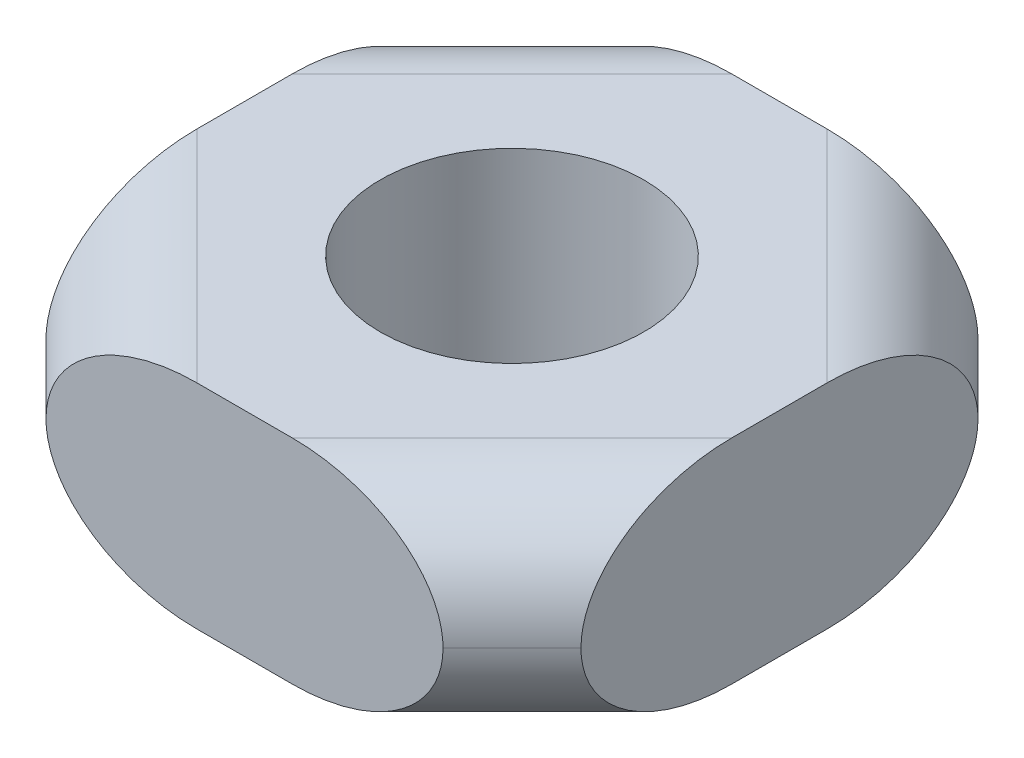
ISO-10303-21;
HEADER;
FILE_DESCRIPTION(('STEP AP214'),'2;1');
FILE_NAME('part.step','',(''),(''),'','','');
FILE_SCHEMA(('AUTOMOTIVE_DESIGN { 1 0 10303 214 1 1 1 1 }'));
ENDSEC;
DATA;
#1=APPLICATION_CONTEXT('core data for automotive mechanical design processes');
#2=APPLICATION_PROTOCOL_DEFINITION('international standard','automotive_design',2000,#1);
#3=PRODUCT_CONTEXT('',#1,'mechanical');
#4=PRODUCT('Part','Part','',(#3));
#5=PRODUCT_RELATED_PRODUCT_CATEGORY('part','',(#4));
#6=PRODUCT_DEFINITION_FORMATION('','',#4);
#7=PRODUCT_DEFINITION_CONTEXT('part definition',#1,'design');
#8=PRODUCT_DEFINITION('design','',#6,#7);
#9=PRODUCT_DEFINITION_SHAPE('','',#8);
#10=(LENGTH_UNIT() NAMED_UNIT(*) SI_UNIT(.MILLI.,.METRE.));
#11=(NAMED_UNIT(*) PLANE_ANGLE_UNIT() SI_UNIT($,.RADIAN.));
#12=(NAMED_UNIT(*) SI_UNIT($,.STERADIAN.) SOLID_ANGLE_UNIT());
#13=UNCERTAINTY_MEASURE_WITH_UNIT(LENGTH_MEASURE(1.E-05),#10,'distance_accuracy_value','');
#14=(GEOMETRIC_REPRESENTATION_CONTEXT(3) GLOBAL_UNCERTAINTY_ASSIGNED_CONTEXT((#13)) GLOBAL_UNIT_ASSIGNED_CONTEXT((#10,
#11,#12)) REPRESENTATION_CONTEXT('',''));
#15=CARTESIAN_POINT('',(0.,0.,0.));
#16=DIRECTION('',(0.,0.,1.));
#17=DIRECTION('',(1.,0.,0.));
#18=AXIS2_PLACEMENT_3D('',#15,#16,#17);
#19=CARTESIAN_POINT('',(0.,5.5,0.));
#20=DIRECTION('',(0.,0.,-1.));
#21=DIRECTION('',(-1.,0.,0.));
#22=AXIS2_PLACEMENT_3D('',#19,#20,#21);
#23=PLANE('',#22);
#24=DIRECTION('',(1.,0.,0.));
#25=VECTOR('',#24,1.);
#26=CARTESIAN_POINT('',(0.,0.,0.));
#27=LINE('',#26,#25);
#28=CARTESIAN_POINT('',(3.88908729652614,0.,0.));
#29=VERTEX_POINT('',#28);
#30=CARTESIAN_POINT('',(6.35254326381662,0.,0.));
#31=VERTEX_POINT('',#30);
#32=EDGE_CURVE('E189',#29,#31,#27,.T.);
#33=ORIENTED_EDGE('',*,*,#32,.T.);
#34=CARTESIAN_POINT('',(6.35254326381662,2.75,0.));
#35=DIRECTION('',(0.,0.,-1.));
#36=DIRECTION('',(1.,0.,0.));
#37=AXIS2_PLACEMENT_3D('',#34,#35,#36);
#38=ELLIPSE('',#37,3.88908729652601,2.75);
#39=CARTESIAN_POINT('',(10.2416305603426,2.75,0.));
#40=VERTEX_POINT('',#39);
#41=EDGE_CURVE('E11',#31,#40,#38,.F.);
#42=ORIENTED_EDGE('',*,*,#41,.T.);
#43=CARTESIAN_POINT('',(6.35254326381662,2.75,0.));
#44=DIRECTION('',(0.,0.,-1.));
#45=DIRECTION('',(-1.,0.,0.));
#46=AXIS2_PLACEMENT_3D('',#43,#44,#45);
#47=ELLIPSE('',#46,3.88908729652601,2.75);
#48=CARTESIAN_POINT('',(6.35254326381662,5.5,0.));
#49=VERTEX_POINT('',#48);
#50=EDGE_CURVE('E46',#40,#49,#47,.F.);
#51=ORIENTED_EDGE('',*,*,#50,.T.);
#52=DIRECTION('',(1.,0.,0.));
#53=VECTOR('',#52,1.);
#54=CARTESIAN_POINT('',(0.,5.5,0.));
#55=LINE('',#54,#53);
#56=CARTESIAN_POINT('',(3.88908729652614,5.5,0.));
#57=VERTEX_POINT('',#56);
#58=EDGE_CURVE('E148',#57,#49,#55,.T.);
#59=ORIENTED_EDGE('',*,*,#58,.F.);
#60=CARTESIAN_POINT('',(3.88908729652614,2.75,0.));
#61=DIRECTION('',(0.,0.,-1.));
#62=DIRECTION('',(-1.,0.,0.));
#63=AXIS2_PLACEMENT_3D('',#60,#61,#62);
#64=ELLIPSE('',#63,3.88908729652613,2.75);
#65=CARTESIAN_POINT('',(0.,2.75,0.));
#66=VERTEX_POINT('',#65);
#67=EDGE_CURVE('E54',#57,#66,#64,.F.);
#68=ORIENTED_EDGE('',*,*,#67,.T.);
#69=CARTESIAN_POINT('',(3.88908729652614,2.75,0.));
#70=DIRECTION('',(0.,0.,-1.));
#71=DIRECTION('',(1.,0.,0.));
#72=AXIS2_PLACEMENT_3D('',#69,#70,#71);
#73=ELLIPSE('',#72,3.88908729652613,2.75);
#74=EDGE_CURVE('E184',#66,#29,#73,.F.);
#75=ORIENTED_EDGE('',*,*,#74,.T.);
#76=EDGE_LOOP('',(#33,#42,#51,#59,#68,#75));
#77=FACE_BOUND('',#76,.T.);
#78=ADVANCED_FACE('F37',(#77),#23,.F.);
#79=CARTESIAN_POINT('',(12.0208152801713,5.5,-1.77918471982866));
#80=DIRECTION('',(-1.,0.,0.));
#81=DIRECTION('',(0.,0.,1.));
#82=AXIS2_PLACEMENT_3D('',#79,#80,#81);
#83=PLANE('',#82);
#84=DIRECTION('',(0.,0.,-1.));
#85=VECTOR('',#84,1.);
#86=CARTESIAN_POINT('',(12.0208152801713,0.,-1.77918471982866));
#87=LINE('',#86,#85);
#88=CARTESIAN_POINT('',(12.0208152801713,0.,-5.66827201635467));
#89=VERTEX_POINT('',#88);
#90=CARTESIAN_POINT('',(12.0208152801713,0.,-8.13172798364552));
#91=VERTEX_POINT('',#90);
#92=EDGE_CURVE('E221',#89,#91,#87,.T.);
#93=ORIENTED_EDGE('',*,*,#92,.T.);
#94=CARTESIAN_POINT('',(12.0208152801713,2.75,-8.13172798364551));
#95=DIRECTION('',(-1.,0.,0.));
#96=DIRECTION('',(0.,0.,-1.));
#97=AXIS2_PLACEMENT_3D('',#94,#95,#96);
#98=ELLIPSE('',#97,3.88908729652589,2.75);
#99=CARTESIAN_POINT('',(12.0208152801713,2.75,-12.0208152801714));
#100=VERTEX_POINT('',#99);
#101=EDGE_CURVE('E181',#91,#100,#98,.F.);
#102=ORIENTED_EDGE('',*,*,#101,.T.);
#103=CARTESIAN_POINT('',(12.0208152801713,2.75,-8.13172798364552));
#104=DIRECTION('',(-1.,0.,0.));
#105=DIRECTION('',(0.,0.,1.));
#106=AXIS2_PLACEMENT_3D('',#103,#104,#105);
#107=ELLIPSE('',#106,3.88908729652589,2.75);
#108=CARTESIAN_POINT('',(12.0208152801713,5.5,-8.13172798364552));
#109=VERTEX_POINT('',#108);
#110=EDGE_CURVE('E179',#100,#109,#107,.F.);
#111=ORIENTED_EDGE('',*,*,#110,.T.);
#112=DIRECTION('',(0.,0.,-1.));
#113=VECTOR('',#112,1.);
#114=CARTESIAN_POINT('',(12.0208152801713,5.5,-1.77918471982866));
#115=LINE('',#114,#113);
#116=CARTESIAN_POINT('',(12.0208152801713,5.5,-5.66827201635467));
#117=VERTEX_POINT('',#116);
#118=EDGE_CURVE('E210',#117,#109,#115,.T.);
#119=ORIENTED_EDGE('',*,*,#118,.F.);
#120=CARTESIAN_POINT('',(12.0208152801713,2.75,-5.66827201635467));
#121=DIRECTION('',(-1.,0.,0.));
#122=DIRECTION('',(0.,0.,1.));
#123=AXIS2_PLACEMENT_3D('',#120,#121,#122);
#124=ELLIPSE('',#123,3.88908729652601,2.75);
#125=CARTESIAN_POINT('',(12.0208152801713,2.75,-1.77918471982866));
#126=VERTEX_POINT('',#125);
#127=EDGE_CURVE('E175',#117,#126,#124,.F.);
#128=ORIENTED_EDGE('',*,*,#127,.T.);
#129=CARTESIAN_POINT('',(12.0208152801713,2.75,-5.66827201635467));
#130=DIRECTION('',(-1.,0.,0.));
#131=DIRECTION('',(0.,0.,-1.));
#132=AXIS2_PLACEMENT_3D('',#129,#130,#131);
#133=ELLIPSE('',#132,3.88908729652601,2.75);
#134=EDGE_CURVE('E177',#126,#89,#133,.F.);
#135=ORIENTED_EDGE('',*,*,#134,.T.);
#136=EDGE_LOOP('',(#93,#102,#111,#119,#128,#135));
#137=FACE_BOUND('',#136,.T.);
#138=ADVANCED_FACE('F247',(#137),#83,.F.);
#139=CARTESIAN_POINT('',(10.2416305603426,5.5,-13.8));
#140=DIRECTION('',(0.,0.,1.));
#141=DIRECTION('',(1.,0.,0.));
#142=AXIS2_PLACEMENT_3D('',#139,#140,#141);
#143=PLANE('',#142);
#144=DIRECTION('',(-1.,0.,0.));
#145=VECTOR('',#144,1.);
#146=CARTESIAN_POINT('',(10.2416305603426,0.,-13.8));
#147=LINE('',#146,#145);
#148=CARTESIAN_POINT('',(6.35254326381649,0.,-13.8));
#149=VERTEX_POINT('',#148);
#150=CARTESIAN_POINT('',(3.88908729652568,0.,-13.8));
#151=VERTEX_POINT('',#150);
#152=EDGE_CURVE('E149',#149,#151,#147,.T.);
#153=ORIENTED_EDGE('',*,*,#152,.T.);
#154=CARTESIAN_POINT('',(3.88908729652568,2.75,-13.8));
#155=DIRECTION('',(0.,0.,1.));
#156=DIRECTION('',(-1.,0.,0.));
#157=AXIS2_PLACEMENT_3D('',#154,#155,#156);
#158=ELLIPSE('',#157,3.88908729652613,2.75);
#159=CARTESIAN_POINT('',(-4.55690173095658E-13,2.75,-13.8));
#160=VERTEX_POINT('',#159);
#161=EDGE_CURVE('E152',#151,#160,#158,.F.);
#162=ORIENTED_EDGE('',*,*,#161,.T.);
#163=CARTESIAN_POINT('',(3.88908729652568,2.75,-13.8));
#164=DIRECTION('',(0.,0.,1.));
#165=DIRECTION('',(1.,0.,0.));
#166=AXIS2_PLACEMENT_3D('',#163,#164,#165);
#167=ELLIPSE('',#166,3.88908729652613,2.75);
#168=CARTESIAN_POINT('',(3.88908729652568,5.5,-13.8));
#169=VERTEX_POINT('',#168);
#170=EDGE_CURVE('E164',#160,#169,#167,.F.);
#171=ORIENTED_EDGE('',*,*,#170,.T.);
#172=DIRECTION('',(-1.,0.,0.));
#173=VECTOR('',#172,1.);
#174=CARTESIAN_POINT('',(10.2416305603426,5.5,-13.8));
#175=LINE('',#174,#173);
#176=CARTESIAN_POINT('',(6.35254326381649,5.5,-13.8));
#177=VERTEX_POINT('',#176);
#178=EDGE_CURVE('E213',#177,#169,#175,.T.);
#179=ORIENTED_EDGE('',*,*,#178,.F.);
#180=CARTESIAN_POINT('',(6.35254326381649,2.75,-13.8));
#181=DIRECTION('',(0.,0.,1.));
#182=DIRECTION('',(1.,0.,0.));
#183=AXIS2_PLACEMENT_3D('',#180,#181,#182);
#184=ELLIPSE('',#183,3.88908729652613,2.75);
#185=CARTESIAN_POINT('',(10.2416305603426,2.75,-13.8));
#186=VERTEX_POINT('',#185);
#187=EDGE_CURVE('E153',#177,#186,#184,.F.);
#188=ORIENTED_EDGE('',*,*,#187,.T.);
#189=CARTESIAN_POINT('',(6.35254326381649,2.75,-13.8));
#190=DIRECTION('',(0.,0.,1.));
#191=DIRECTION('',(-1.,0.,0.));
#192=AXIS2_PLACEMENT_3D('',#189,#190,#191);
#193=ELLIPSE('',#192,3.88908729652613,2.75);
#194=EDGE_CURVE('E156',#186,#149,#193,.F.);
#195=ORIENTED_EDGE('',*,*,#194,.T.);
#196=EDGE_LOOP('',(#153,#162,#171,#179,#188,#195));
#197=FACE_BOUND('',#196,.T.);
#198=ADVANCED_FACE('F258',(#197),#143,.F.);
#199=CARTESIAN_POINT('',(-1.77918471982866,5.5,-12.0208152801719));
#200=DIRECTION('',(1.,0.,0.));
#201=DIRECTION('',(0.,0.,-1.));
#202=AXIS2_PLACEMENT_3D('',#199,#200,#201);
#203=PLANE('',#202);
#204=CARTESIAN_POINT('',(-1.77918471982866,2.75,-8.13172798364597));
#205=DIRECTION('',(1.,0.,0.));
#206=DIRECTION('',(0.,0.,-1.));
#207=AXIS2_PLACEMENT_3D('',#204,#205,#206);
#208=ELLIPSE('',#207,3.88908729652589,2.75);
#209=CARTESIAN_POINT('',(-1.77918471982866,5.5,-8.13172798364597));
#210=VERTEX_POINT('',#209);
#211=CARTESIAN_POINT('',(-1.77918471982866,2.75,-12.0208152801719));
#212=VERTEX_POINT('',#211);
#213=EDGE_CURVE('E132',#210,#212,#208,.F.);
#214=ORIENTED_EDGE('',*,*,#213,.T.);
#215=CARTESIAN_POINT('',(-1.77918471982866,2.75,-8.13172798364597));
#216=DIRECTION('',(1.,0.,0.));
#217=DIRECTION('',(0.,0.,1.));
#218=AXIS2_PLACEMENT_3D('',#215,#216,#217);
#219=ELLIPSE('',#218,3.88908729652589,2.75);
#220=CARTESIAN_POINT('',(-1.77918471982866,0.,-8.13172798364597));
#221=VERTEX_POINT('',#220);
#222=EDGE_CURVE('E126',#212,#221,#219,.F.);
#223=ORIENTED_EDGE('',*,*,#222,.T.);
#224=DIRECTION('',(0.,0.,1.));
#225=VECTOR('',#224,1.);
#226=CARTESIAN_POINT('',(-1.77918471982866,0.,-12.0208152801719));
#227=LINE('',#226,#225);
#228=CARTESIAN_POINT('',(-1.77918471982866,0.,-5.66827201635444));
#229=VERTEX_POINT('',#228);
#230=EDGE_CURVE('E129',#221,#229,#227,.T.);
#231=ORIENTED_EDGE('',*,*,#230,.T.);
#232=CARTESIAN_POINT('',(-1.77918471982866,2.75,-5.66827201635444));
#233=DIRECTION('',(1.,0.,0.));
#234=DIRECTION('',(0.,0.,1.));
#235=AXIS2_PLACEMENT_3D('',#232,#233,#234);
#236=ELLIPSE('',#235,3.88908729652589,2.75);
#237=CARTESIAN_POINT('',(-1.77918471982866,2.75,-1.77918471982855));
#238=VERTEX_POINT('',#237);
#239=EDGE_CURVE('E226',#229,#238,#236,.F.);
#240=ORIENTED_EDGE('',*,*,#239,.T.);
#241=CARTESIAN_POINT('',(-1.77918471982866,2.75,-5.66827201635444));
#242=DIRECTION('',(1.,0.,0.));
#243=DIRECTION('',(0.,0.,-1.));
#244=AXIS2_PLACEMENT_3D('',#241,#242,#243);
#245=ELLIPSE('',#244,3.88908729652589,2.75);
#246=CARTESIAN_POINT('',(-1.77918471982866,5.5,-5.66827201635444));
#247=VERTEX_POINT('',#246);
#248=EDGE_CURVE('E219',#238,#247,#245,.F.);
#249=ORIENTED_EDGE('',*,*,#248,.T.);
#250=DIRECTION('',(0.,0.,1.));
#251=VECTOR('',#250,1.);
#252=CARTESIAN_POINT('',(-1.77918471982866,5.5,-12.0208152801719));
#253=LINE('',#252,#251);
#254=EDGE_CURVE('E216',#210,#247,#253,.T.);
#255=ORIENTED_EDGE('',*,*,#254,.F.);
#256=EDGE_LOOP('',(#214,#223,#231,#240,#249,#255));
#257=FACE_BOUND('',#256,.T.);
#258=ADVANCED_FACE('F128',(#257),#203,.F.);
#259=CARTESIAN_POINT('',(0.,5.5,0.));
#260=DIRECTION('',(0.,1.,0.));
#261=DIRECTION('',(0.,0.,1.));
#262=AXIS2_PLACEMENT_3D('',#259,#260,#261);
#263=PLANE('',#262);
#264=CARTESIAN_POINT('',(5.12081528017109,5.5,-6.9000000000002));
#265=DIRECTION('',(0.,1.,0.));
#266=DIRECTION('',(0.,0.,1.));
#267=AXIS2_PLACEMENT_3D('',#264,#265,#266);
#268=CIRCLE('',#267,3.39999999999999);
#269=CARTESIAN_POINT('',(5.12081528017109,5.5,-3.50000000000021));
#270=VERTEX_POINT('',#269);
#271=EDGE_CURVE('E200',#270,#270,#268,.T.);
#272=ORIENTED_EDGE('',*,*,#271,.F.);
#273=EDGE_LOOP('',(#272));
#274=FACE_BOUND('',#273,.T.);
#275=ORIENTED_EDGE('',*,*,#178,.T.);
#276=DIRECTION('',(-0.70710678118657,0.,0.707106781186525));
#277=VECTOR('',#276,1.);
#278=CARTESIAN_POINT('',(0.165358928434281,5.5,-10.0762716319088));
#279=LINE('',#278,#277);
#280=EDGE_CURVE('E173',#169,#210,#279,.T.);
#281=ORIENTED_EDGE('',*,*,#280,.T.);
#282=ORIENTED_EDGE('',*,*,#254,.T.);
#283=DIRECTION('',(0.70710678118657,0.,0.707106781186525));
#284=VECTOR('',#283,1.);
#285=CARTESIAN_POINT('',(1.94454364826294,5.5,-1.94454364826307));
#286=LINE('',#285,#284);
#287=EDGE_CURVE('E167',#247,#57,#286,.T.);
#288=ORIENTED_EDGE('',*,*,#287,.T.);
#289=ORIENTED_EDGE('',*,*,#58,.T.);
#290=DIRECTION('',(0.707106781186548,0.,-0.707106781186548));
#291=VECTOR('',#290,1.);
#292=CARTESIAN_POINT('',(10.0762716319083,5.5,-3.72372836809167));
#293=LINE('',#292,#291);
#294=EDGE_CURVE('E169',#49,#117,#293,.T.);
#295=ORIENTED_EDGE('',*,*,#294,.T.);
#296=ORIENTED_EDGE('',*,*,#118,.T.);
#297=DIRECTION('',(-0.70710678118657,0.,-0.707106781186525));
#298=VECTOR('',#297,1.);
#299=CARTESIAN_POINT('',(8.29708691207968,5.5,-11.8554563517369));
#300=LINE('',#299,#298);
#301=EDGE_CURVE('E171',#109,#177,#300,.T.);
#302=ORIENTED_EDGE('',*,*,#301,.T.);
#303=EDGE_LOOP('',(#275,#281,#282,#288,#289,#295,#296,#302));
#304=FACE_BOUND('',#303,.T.);
#305=ADVANCED_FACE('F239',(#274,#304),#263,.T.);
#306=CARTESIAN_POINT('',(0.,0.,0.));
#307=DIRECTION('',(0.,1.,0.));
#308=DIRECTION('',(0.,0.,1.));
#309=AXIS2_PLACEMENT_3D('',#306,#307,#308);
#310=PLANE('',#309);
#311=CARTESIAN_POINT('',(5.12081528017109,0.,-6.9000000000002));
#312=DIRECTION('',(0.,1.,0.));
#313=DIRECTION('',(0.,0.,1.));
#314=AXIS2_PLACEMENT_3D('',#311,#312,#313);
#315=CIRCLE('',#314,3.39999999999999);
#316=CARTESIAN_POINT('',(5.12081528017109,0.,-3.50000000000022));
#317=VERTEX_POINT('',#316);
#318=EDGE_CURVE('E41',#317,#317,#315,.T.);
#319=ORIENTED_EDGE('',*,*,#318,.T.);
#320=EDGE_LOOP('',(#319));
#321=FACE_BOUND('',#320,.T.);
#322=ORIENTED_EDGE('',*,*,#230,.F.);
#323=DIRECTION('',(-0.70710678118657,0.,0.707106781186525));
#324=VECTOR('',#323,1.);
#325=CARTESIAN_POINT('',(-4.95545635173726,0.,-4.95545635173757));
#326=LINE('',#325,#324);
#327=EDGE_CURVE('E144',#221,#151,#326,.F.);
#328=ORIENTED_EDGE('',*,*,#327,.T.);
#329=ORIENTED_EDGE('',*,*,#152,.F.);
#330=DIRECTION('',(-0.70710678118657,0.,-0.707106781186525));
#331=VECTOR('',#330,1.);
#332=CARTESIAN_POINT('',(10.076271631908,0.,-10.0762716319087));
#333=LINE('',#332,#331);
#334=EDGE_CURVE('E154',#149,#91,#333,.F.);
#335=ORIENTED_EDGE('',*,*,#334,.T.);
#336=ORIENTED_EDGE('',*,*,#92,.F.);
#337=DIRECTION('',(0.707106781186548,0.,-0.707106781186548));
#338=VECTOR('',#337,1.);
#339=CARTESIAN_POINT('',(3.17627163190831,0.,3.17627163190831));
#340=LINE('',#339,#338);
#341=EDGE_CURVE('E159',#89,#31,#340,.F.);
#342=ORIENTED_EDGE('',*,*,#341,.T.);
#343=ORIENTED_EDGE('',*,*,#32,.F.);
#344=DIRECTION('',(0.70710678118657,0.,0.707106781186525));
#345=VECTOR('',#344,1.);
#346=CARTESIAN_POINT('',(1.94454364826294,0.,-1.94454364826307));
#347=LINE('',#346,#345);
#348=EDGE_CURVE('E137',#29,#229,#347,.F.);
#349=ORIENTED_EDGE('',*,*,#348,.T.);
#350=EDGE_LOOP('',(#322,#328,#329,#335,#336,#342,#343,#349));
#351=FACE_BOUND('',#350,.T.);
#352=ADVANCED_FACE('F142',(#321,#351),#310,.F.);
#353=CARTESIAN_POINT('',(-4.95545635173726,2.75,-4.95545635173757));
#354=DIRECTION('',(0.70710678118657,0.,-0.707106781186525));
#355=DIRECTION('',(-0.707106781186525,0.,-0.70710678118657));
#356=AXIS2_PLACEMENT_3D('',#353,#354,#355);
#357=CYLINDRICAL_SURFACE('',#356,2.75);
#358=ORIENTED_EDGE('',*,*,#280,.F.);
#359=ORIENTED_EDGE('',*,*,#170,.F.);
#360=DIRECTION('',(-0.70710678118657,0.,0.707106781186525));
#361=VECTOR('',#360,1.);
#362=CARTESIAN_POINT('',(-4.53901239511056E-13,2.75,-13.8));
#363=LINE('',#362,#361);
#364=EDGE_CURVE('E187',#212,#160,#363,.F.);
#365=ORIENTED_EDGE('',*,*,#364,.F.);
#366=ORIENTED_EDGE('',*,*,#213,.F.);
#367=EDGE_LOOP('',(#358,#359,#365,#366));
#368=FACE_BOUND('',#367,.T.);
#369=ADVANCED_FACE('F262',(#368),#357,.T.);
#370=CARTESIAN_POINT('',(1.94454364826249,2.75,-11.8554563517369));
#371=DIRECTION('',(-0.70710678118657,0.,0.707106781186525));
#372=DIRECTION('',(0.707106781186525,0.,0.70710678118657));
#373=AXIS2_PLACEMENT_3D('',#370,#371,#372);
#374=CYLINDRICAL_SURFACE('',#373,2.75);
#375=ORIENTED_EDGE('',*,*,#161,.F.);
#376=ORIENTED_EDGE('',*,*,#327,.F.);
#377=ORIENTED_EDGE('',*,*,#222,.F.);
#378=ORIENTED_EDGE('',*,*,#364,.T.);
#379=EDGE_LOOP('',(#375,#376,#377,#378));
#380=FACE_BOUND('',#379,.T.);
#381=ADVANCED_FACE('F151',(#380),#374,.T.);
#382=CARTESIAN_POINT('',(10.076271631908,2.75,-10.0762716319087));
#383=DIRECTION('',(0.70710678118657,0.,0.707106781186525));
#384=DIRECTION('',(0.707106781186525,0.,-0.70710678118657));
#385=AXIS2_PLACEMENT_3D('',#382,#383,#384);
#386=CYLINDRICAL_SURFACE('',#385,2.75);
#387=ORIENTED_EDGE('',*,*,#301,.F.);
#388=ORIENTED_EDGE('',*,*,#110,.F.);
#389=DIRECTION('',(-0.70710678118657,0.,-0.707106781186525));
#390=VECTOR('',#389,1.);
#391=CARTESIAN_POINT('',(12.0208152801713,2.75,-12.0208152801714));
#392=LINE('',#391,#390);
#393=EDGE_CURVE('E190',#186,#100,#392,.F.);
#394=ORIENTED_EDGE('',*,*,#393,.F.);
#395=ORIENTED_EDGE('',*,*,#187,.F.);
#396=EDGE_LOOP('',(#387,#388,#394,#395));
#397=FACE_BOUND('',#396,.T.);
#398=ADVANCED_FACE('F254',(#397),#386,.T.);
#399=CARTESIAN_POINT('',(10.0762716319083,2.75,-10.0762716319083));
#400=DIRECTION('',(-0.70710678118657,0.,-0.707106781186525));
#401=DIRECTION('',(-0.707106781186525,0.,0.70710678118657));
#402=AXIS2_PLACEMENT_3D('',#399,#400,#401);
#403=CYLINDRICAL_SURFACE('',#402,2.75);
#404=ORIENTED_EDGE('',*,*,#101,.F.);
#405=ORIENTED_EDGE('',*,*,#334,.F.);
#406=ORIENTED_EDGE('',*,*,#194,.F.);
#407=ORIENTED_EDGE('',*,*,#393,.T.);
#408=EDGE_LOOP('',(#404,#405,#406,#407));
#409=FACE_BOUND('',#408,.T.);
#410=ADVANCED_FACE('F298',(#409),#403,.T.);
#411=CARTESIAN_POINT('',(3.17627163190831,2.75,3.17627163190831));
#412=DIRECTION('',(-0.707106781186548,0.,0.707106781186548));
#413=DIRECTION('',(0.707106781186548,0.,0.707106781186548));
#414=AXIS2_PLACEMENT_3D('',#411,#412,#413);
#415=CYLINDRICAL_SURFACE('',#414,2.75);
#416=ORIENTED_EDGE('',*,*,#294,.F.);
#417=ORIENTED_EDGE('',*,*,#50,.F.);
#418=DIRECTION('',(0.707106781186548,0.,-0.707106781186548));
#419=VECTOR('',#418,1.);
#420=CARTESIAN_POINT('',(10.2416305603426,2.75,0.));
#421=LINE('',#420,#419);
#422=EDGE_CURVE('E193',#126,#40,#421,.F.);
#423=ORIENTED_EDGE('',*,*,#422,.F.);
#424=ORIENTED_EDGE('',*,*,#127,.F.);
#425=EDGE_LOOP('',(#416,#417,#423,#424));
#426=FACE_BOUND('',#425,.T.);
#427=ADVANCED_FACE('F243',(#426),#415,.T.);
#428=CARTESIAN_POINT('',(8.29708691207962,2.75,-1.94454364826301));
#429=DIRECTION('',(0.707106781186548,0.,-0.707106781186548));
#430=DIRECTION('',(-0.707106781186548,0.,-0.707106781186548));
#431=AXIS2_PLACEMENT_3D('',#428,#429,#430);
#432=CYLINDRICAL_SURFACE('',#431,2.75);
#433=ORIENTED_EDGE('',*,*,#41,.F.);
#434=ORIENTED_EDGE('',*,*,#341,.F.);
#435=ORIENTED_EDGE('',*,*,#134,.F.);
#436=ORIENTED_EDGE('',*,*,#422,.T.);
#437=EDGE_LOOP('',(#433,#434,#435,#436));
#438=FACE_BOUND('',#437,.T.);
#439=ADVANCED_FACE('F245',(#438),#432,.T.);
#440=CARTESIAN_POINT('',(1.94454364826294,2.75,-1.94454364826307));
#441=DIRECTION('',(-0.70710678118657,0.,-0.707106781186525));
#442=DIRECTION('',(-0.707106781186525,0.,0.70710678118657));
#443=AXIS2_PLACEMENT_3D('',#440,#441,#442);
#444=CYLINDRICAL_SURFACE('',#443,2.75);
#445=ORIENTED_EDGE('',*,*,#287,.F.);
#446=ORIENTED_EDGE('',*,*,#248,.F.);
#447=DIRECTION('',(0.70710678118657,0.,0.707106781186525));
#448=VECTOR('',#447,1.);
#449=CARTESIAN_POINT('',(-1.77918471982866,2.75,-1.77918471982855));
#450=LINE('',#449,#448);
#451=EDGE_CURVE('E195',#66,#238,#450,.F.);
#452=ORIENTED_EDGE('',*,*,#451,.F.);
#453=ORIENTED_EDGE('',*,*,#67,.F.);
#454=EDGE_LOOP('',(#445,#446,#452,#453));
#455=FACE_BOUND('',#454,.T.);
#456=ADVANCED_FACE('F39',(#455),#444,.T.);
#457=CARTESIAN_POINT('',(0.16535892843428,2.75,-3.72372836809162));
#458=DIRECTION('',(0.70710678118657,0.,0.707106781186525));
#459=DIRECTION('',(0.707106781186525,0.,-0.70710678118657));
#460=AXIS2_PLACEMENT_3D('',#457,#458,#459);
#461=CYLINDRICAL_SURFACE('',#460,2.75);
#462=ORIENTED_EDGE('',*,*,#239,.F.);
#463=ORIENTED_EDGE('',*,*,#348,.F.);
#464=ORIENTED_EDGE('',*,*,#74,.F.);
#465=ORIENTED_EDGE('',*,*,#451,.T.);
#466=EDGE_LOOP('',(#462,#463,#464,#465));
#467=FACE_BOUND('',#466,.T.);
#468=ADVANCED_FACE('F234',(#467),#461,.T.);
#469=CARTESIAN_POINT('',(5.12081528017109,5.5,-6.9000000000002));
#470=DIRECTION('',(0.,1.,0.));
#471=DIRECTION('',(0.,0.,1.));
#472=AXIS2_PLACEMENT_3D('',#469,#470,#471);
#473=CYLINDRICAL_SURFACE('',#472,3.39999999999999);
#474=ORIENTED_EDGE('',*,*,#271,.T.);
#475=EDGE_LOOP('',(#474));
#476=FACE_BOUND('',#475,.T.);
#477=ORIENTED_EDGE('',*,*,#318,.F.);
#478=EDGE_LOOP('',(#477));
#479=FACE_BOUND('',#478,.T.);
#480=ADVANCED_FACE('F286',(#476,#479),#473,.F.);
#481=CLOSED_SHELL('',(#78,#138,#198,#258,#305,#352,#369,#381,#398,#410,#427,#439,#456,#468,#480));
#482=MANIFOLD_SOLID_BREP('B2',#481);
#483=ADVANCED_BREP_SHAPE_REPRESENTATION('',(#18,#482),#14);
#484=SHAPE_DEFINITION_REPRESENTATION(#9,#483);
ENDSEC;
END-ISO-10303-21;
